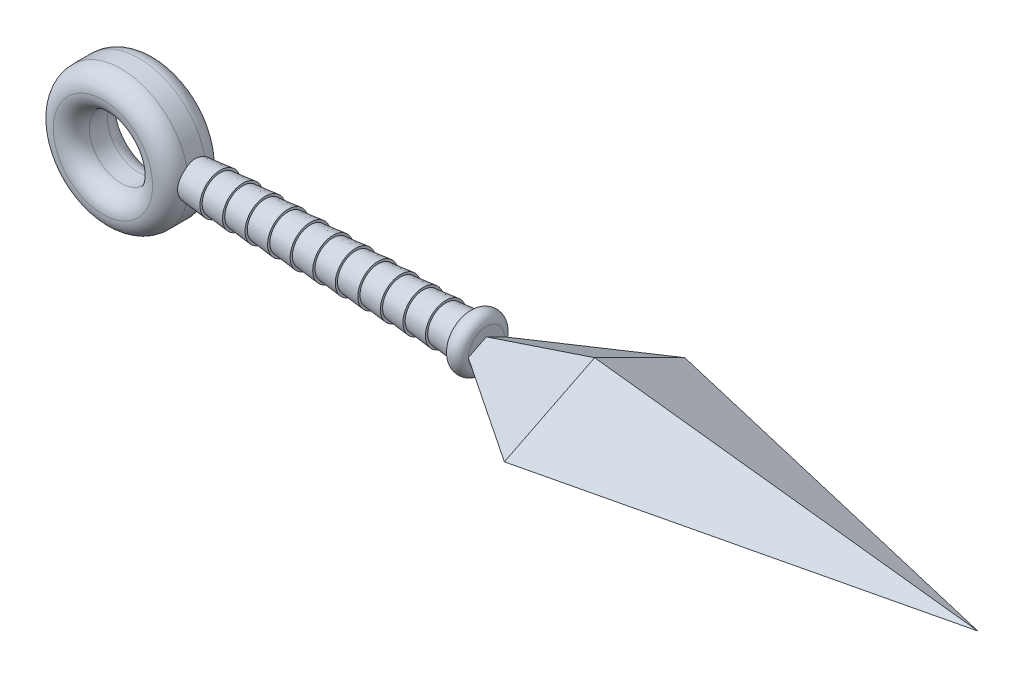
ISO-10303-21;
HEADER;
FILE_DESCRIPTION(('STEP AP214'),'2;1');
FILE_NAME('part.step','',(''),(''),'','','');
FILE_SCHEMA(('AUTOMOTIVE_DESIGN { 1 0 10303 214 1 1 1 1 }'));
ENDSEC;
DATA;
#1=APPLICATION_CONTEXT('core data for automotive mechanical design processes');
#2=APPLICATION_PROTOCOL_DEFINITION('international standard','automotive_design',2000,#1);
#3=PRODUCT_CONTEXT('',#1,'mechanical');
#4=PRODUCT('Part','Part','',(#3));
#5=PRODUCT_RELATED_PRODUCT_CATEGORY('part','',(#4));
#6=PRODUCT_DEFINITION_FORMATION('','',#4);
#7=PRODUCT_DEFINITION_CONTEXT('part definition',#1,'design');
#8=PRODUCT_DEFINITION('design','',#6,#7);
#9=PRODUCT_DEFINITION_SHAPE('','',#8);
#10=(LENGTH_UNIT() NAMED_UNIT(*) SI_UNIT(.MILLI.,.METRE.));
#11=(NAMED_UNIT(*) PLANE_ANGLE_UNIT() SI_UNIT($,.RADIAN.));
#12=(NAMED_UNIT(*) SI_UNIT($,.STERADIAN.) SOLID_ANGLE_UNIT());
#13=UNCERTAINTY_MEASURE_WITH_UNIT(LENGTH_MEASURE(1.E-05),#10,'distance_accuracy_value','');
#14=(GEOMETRIC_REPRESENTATION_CONTEXT(3) GLOBAL_UNCERTAINTY_ASSIGNED_CONTEXT((#13)) GLOBAL_UNIT_ASSIGNED_CONTEXT((#10,
#11,#12)) REPRESENTATION_CONTEXT('',''));
#15=CARTESIAN_POINT('',(0.,0.,0.));
#16=DIRECTION('',(0.,0.,1.));
#17=DIRECTION('',(1.,0.,0.));
#18=AXIS2_PLACEMENT_3D('',#15,#16,#17);
#19=CARTESIAN_POINT('',(79.,0.,0.));
#20=DIRECTION('',(-1.,0.,0.));
#21=DIRECTION('',(0.,0.,1.));
#22=AXIS2_PLACEMENT_3D('',#19,#20,#21);
#23=PLANE('',#22);
#24=DIRECTION('',(0.,-0.447213595499958,0.894427190999916));
#25=VECTOR('',#24,1.);
#26=CARTESIAN_POINT('',(79.,2.,0.));
#27=LINE('',#26,#25);
#28=CARTESIAN_POINT('',(79.,2.,0.));
#29=VERTEX_POINT('',#28);
#30=CARTESIAN_POINT('',(79.,0.,4.));
#31=VERTEX_POINT('',#30);
#32=EDGE_CURVE('E376',#29,#31,#27,.T.);
#33=ORIENTED_EDGE('',*,*,#32,.F.);
#34=DIRECTION('',(0.,0.447213595499958,0.894427190999916));
#35=VECTOR('',#34,1.);
#36=CARTESIAN_POINT('',(79.,0.,-4.));
#37=LINE('',#36,#35);
#38=CARTESIAN_POINT('',(79.,0.,-4.));
#39=VERTEX_POINT('',#38);
#40=EDGE_CURVE('E128',#39,#29,#37,.T.);
#41=ORIENTED_EDGE('',*,*,#40,.F.);
#42=CARTESIAN_POINT('',(79.,0.,0.));
#43=DIRECTION('',(1.,0.,0.));
#44=DIRECTION('',(0.,0.,-1.));
#45=AXIS2_PLACEMENT_3D('',#42,#43,#44);
#46=CIRCLE('',#45,4.);
#47=EDGE_CURVE('E75',#39,#31,#46,.T.);
#48=ORIENTED_EDGE('',*,*,#47,.T.);
#49=EDGE_LOOP('',(#33,#41,#48));
#50=FACE_BOUND('',#49,.T.);
#51=ADVANCED_FACE('F65',(#50),#23,.F.);
#52=CARTESIAN_POINT('',(77.,0.,0.));
#53=DIRECTION('',(1.,0.,0.));
#54=DIRECTION('',(0.,0.,-1.));
#55=AXIS2_PLACEMENT_3D('',#52,#53,#54);
#56=TOROIDAL_SURFACE('',#55,4.,2.);
#57=ORIENTED_EDGE('',*,*,#47,.F.);
#58=EDGE_CURVE('E387',#31,#39,#46,.T.);
#59=ORIENTED_EDGE('',*,*,#58,.F.);
#60=EDGE_LOOP('',(#57,#59));
#61=FACE_BOUND('',#60,.T.);
#62=CARTESIAN_POINT('',(75.0652035958993,0.,0.));
#63=DIRECTION('',(1.,0.,0.));
#64=DIRECTION('',(0.,0.,-1.));
#65=AXIS2_PLACEMENT_3D('',#62,#63,#64);
#66=CIRCLE('',#65,4.50652035958993);
#67=CARTESIAN_POINT('',(75.0652035958993,0.,-4.50652035958993));
#68=VERTEX_POINT('',#67);
#69=EDGE_CURVE('E13',#68,#68,#66,.F.);
#70=ORIENTED_EDGE('',*,*,#69,.F.);
#71=EDGE_LOOP('',(#70));
#72=FACE_BOUND('',#71,.T.);
#73=ADVANCED_FACE('F67',(#61,#72),#56,.T.);
#74=ORIENTED_EDGE('',*,*,#58,.T.);
#75=DIRECTION('',(0.,0.447213595499958,-0.894427190999916));
#76=VECTOR('',#75,1.);
#77=CARTESIAN_POINT('',(79.,-2.,0.));
#78=LINE('',#77,#76);
#79=CARTESIAN_POINT('',(79.,-2.,0.));
#80=VERTEX_POINT('',#79);
#81=EDGE_CURVE('E212',#80,#39,#78,.T.);
#82=ORIENTED_EDGE('',*,*,#81,.F.);
#83=DIRECTION('',(0.,-0.447213595499958,-0.894427190999916));
#84=VECTOR('',#83,1.);
#85=CARTESIAN_POINT('',(79.,0.,4.));
#86=LINE('',#85,#84);
#87=EDGE_CURVE('E379',#31,#80,#86,.T.);
#88=ORIENTED_EDGE('',*,*,#87,.F.);
#89=EDGE_LOOP('',(#74,#82,#88));
#90=FACE_BOUND('',#89,.T.);
#91=ADVANCED_FACE('F357',(#90),#23,.F.);
#92=CARTESIAN_POINT('',(75.,0.,0.));
#93=DIRECTION('',(1.,0.,0.));
#94=DIRECTION('',(0.,0.,-1.));
#95=AXIS2_PLACEMENT_3D('',#92,#93,#94);
#96=CONICAL_SURFACE('',#95,4.5,0.0996686524911618);
#97=CARTESIAN_POINT('',(70.,0.,0.));
#98=DIRECTION('',(-1.,0.,0.));
#99=DIRECTION('',(0.,0.,1.));
#100=AXIS2_PLACEMENT_3D('',#97,#98,#99);
#101=CIRCLE('',#100,4.);
#102=CARTESIAN_POINT('',(70.,0.,4.));
#103=VERTEX_POINT('',#102);
#104=EDGE_CURVE('E207',#103,#103,#101,.T.);
#105=ORIENTED_EDGE('',*,*,#104,.F.);
#106=EDGE_LOOP('',(#105));
#107=FACE_BOUND('',#106,.T.);
#108=ORIENTED_EDGE('',*,*,#69,.T.);
#109=EDGE_LOOP('',(#108));
#110=FACE_BOUND('',#109,.T.);
#111=ADVANCED_FACE('F359',(#107,#110),#96,.T.);
#112=CARTESIAN_POINT('',(0.,0.,6.));
#113=DIRECTION('',(0.,0.,-1.));
#114=DIRECTION('',(-1.,0.,0.));
#115=AXIS2_PLACEMENT_3D('',#112,#113,#114);
#116=CYLINDRICAL_SURFACE('',#115,15.);
#117=CARTESIAN_POINT('',(14.6053071349914,-3.41833343788607,2.00020000000001));
#118=CARTESIAN_POINT('',(14.5924589112699,-3.47320777410244,1.90389756692699));
#119=CARTESIAN_POINT('',(14.5802234231269,-3.52411177260544,1.80524747907719));
#120=CARTESIAN_POINT('',(14.5572953684385,-3.61766662668039,1.60392692198255));
#121=CARTESIAN_POINT('',(14.5466029263319,-3.66031681671976,1.50125612933652));
#122=CARTESIAN_POINT('',(14.5270869483398,-3.73701764129119,1.29265282019843));
#123=CARTESIAN_POINT('',(14.5182621992119,-3.77107386119855,1.1867224726432));
#124=CARTESIAN_POINT('',(14.5027318096196,-3.83036723531258,0.972274562545084));
#125=CARTESIAN_POINT('',(14.4960260572965,-3.85560485504713,0.863757136895433));
#126=CARTESIAN_POINT('',(14.4849300755814,-3.89708381566666,0.644796044806405));
#127=CARTESIAN_POINT('',(14.480541952856,-3.91331697239356,0.534350719817065));
#128=CARTESIAN_POINT('',(14.4742230743012,-3.93662457040182,0.312388307830953));
#129=CARTESIAN_POINT('',(14.4722931772722,-3.94369581091113,0.200870859980929));
#130=CARTESIAN_POINT('',(14.4709530171331,-3.94861055225303,-0.0223730528843796));
#131=CARTESIAN_POINT('',(14.4715425436065,-3.94645482370111,-0.13409949966554));
#132=CARTESIAN_POINT('',(14.4752226410761,-3.93293508592278,-0.356952415483685));
#133=CARTESIAN_POINT('',(14.4783132129355,-3.92157107351837,-0.468078884313589));
#134=CARTESIAN_POINT('',(14.4868465547033,-3.88992812377862,-0.687536449808845));
#135=CARTESIAN_POINT('',(14.4922593378006,-3.86976278270413,-0.795885125640328));
#136=CARTESIAN_POINT('',(14.5052686634585,-3.82070988278798,-1.01041620198221));
#137=CARTESIAN_POINT('',(14.5128644552535,-3.79182532242903,-1.11659933382904));
#138=CARTESIAN_POINT('',(14.5300059594372,-3.72559964127352,-1.32595579729252));
#139=CARTESIAN_POINT('',(14.539548780082,-3.68827105278459,-1.42913333609936));
#140=CARTESIAN_POINT('',(14.5603169880491,-3.60541198642497,-1.63192454881869));
#141=CARTESIAN_POINT('',(14.5715417132424,-3.55988473477098,-1.73153960617109));
#142=CARTESIAN_POINT('',(14.5905060465131,-3.48109636597889,-1.88686514125554));
#143=CARTESIAN_POINT('',(14.5978036226992,-3.45038934518262,-1.94393634445103));
#144=CARTESIAN_POINT('',(14.6053071349914,-3.41833343788607,-2.00020000000001));
#145=B_SPLINE_CURVE_WITH_KNOTS('',3,(#117,#118,#119,#120,#121,#122,#123,#124,#125,#126,#127,
#128,#129,#130,#131,#132,#133,#134,#135,#136,#137,#138,#139,#140,#141,#142,#143,#144),
.UNSPECIFIED.,.F.,.F.,(4,2,2,2,2,2,2,2,2,2,2,2,2,4),(0.,0.334653429279474,0.669333831568065,
1.00379615557934,1.33824082088474,1.67298896699972,2.0078540279433,2.34269112226372,
2.67752833214456,3.00816609769696,3.33869028836177,3.66872710911672,3.9986343413259,
4.19420455925245),.UNSPECIFIED.);
#146=CARTESIAN_POINT('',(14.6052804693855,-3.41844736840965,2.));
#147=VERTEX_POINT('',#146);
#148=CARTESIAN_POINT('',(14.6052804693855,-3.41844736840965,-2.));
#149=VERTEX_POINT('',#148);
#150=EDGE_CURVE('E304',#147,#149,#145,.T.);
#151=ORIENTED_EDGE('',*,*,#150,.F.);
#152=CARTESIAN_POINT('',(0.,0.,2.));
#153=DIRECTION('',(0.,0.,1.));
#154=DIRECTION('',(1.,0.,0.));
#155=AXIS2_PLACEMENT_3D('',#152,#153,#154);
#156=CIRCLE('',#155,15.);
#157=CARTESIAN_POINT('',(14.6052804693837,3.41844736841711,2.));
#158=VERTEX_POINT('',#157);
#159=EDGE_CURVE('E415',#147,#158,#156,.F.);
#160=ORIENTED_EDGE('',*,*,#159,.T.);
#161=CARTESIAN_POINT('',(14.6053071349914,3.41833343788607,-2.00020000000001));
#162=CARTESIAN_POINT('',(14.5924589112699,3.47320777410244,-1.90389756692699));
#163=CARTESIAN_POINT('',(14.5802234231269,3.52411177260544,-1.80524747907719));
#164=CARTESIAN_POINT('',(14.5572953684385,3.61766662668039,-1.60392692198255));
#165=CARTESIAN_POINT('',(14.5466029263319,3.66031681671976,-1.50125612933652));
#166=CARTESIAN_POINT('',(14.5270869483398,3.73701764129119,-1.29265282019843));
#167=CARTESIAN_POINT('',(14.5182621992119,3.77107386119855,-1.1867224726432));
#168=CARTESIAN_POINT('',(14.5027318096196,3.83036723531258,-0.972274562545084));
#169=CARTESIAN_POINT('',(14.4960260572965,3.85560485504713,-0.863757136895433));
#170=CARTESIAN_POINT('',(14.4849300755814,3.89708381566666,-0.644796044806405));
#171=CARTESIAN_POINT('',(14.480541952856,3.91331697239356,-0.534350719817065));
#172=CARTESIAN_POINT('',(14.4742230743012,3.93662457040182,-0.312388307830953));
#173=CARTESIAN_POINT('',(14.4722931772722,3.94369581091113,-0.200870859980929));
#174=CARTESIAN_POINT('',(14.4709530171331,3.94861055225303,0.0223730528843796));
#175=CARTESIAN_POINT('',(14.4715425436065,3.94645482370111,0.13409949966554));
#176=CARTESIAN_POINT('',(14.4752226410761,3.93293508592278,0.356952415483685));
#177=CARTESIAN_POINT('',(14.4783132129355,3.92157107351837,0.468078884313589));
#178=CARTESIAN_POINT('',(14.4868465547033,3.88992812377862,0.687536449808845));
#179=CARTESIAN_POINT('',(14.4922593378006,3.86976278270413,0.795885125640328));
#180=CARTESIAN_POINT('',(14.5052686634585,3.82070988278798,1.01041620198221));
#181=CARTESIAN_POINT('',(14.5128644552535,3.79182532242903,1.11659933382904));
#182=CARTESIAN_POINT('',(14.5300059594372,3.72559964127352,1.32595579729252));
#183=CARTESIAN_POINT('',(14.539548780082,3.68827105278459,1.42913333609936));
#184=CARTESIAN_POINT('',(14.5603169880491,3.60541198642497,1.63192454881869));
#185=CARTESIAN_POINT('',(14.5715417132424,3.55988473477098,1.73153960617109));
#186=CARTESIAN_POINT('',(14.5905060465131,3.48109636597889,1.88686514125554));
#187=CARTESIAN_POINT('',(14.5978036226992,3.45038934518262,1.94393634445103));
#188=CARTESIAN_POINT('',(14.6053071349914,3.41833343788607,2.00020000000001));
#189=B_SPLINE_CURVE_WITH_KNOTS('',3,(#161,#162,#163,#164,#165,#166,#167,#168,#169,#170,#171,
#172,#173,#174,#175,#176,#177,#178,#179,#180,#181,#182,#183,#184,#185,#186,#187,#188),
.UNSPECIFIED.,.F.,.F.,(4,2,2,2,2,2,2,2,2,2,2,2,2,4),(0.,0.334653429279474,0.669333831568065,
1.00379615557934,1.33824082088474,1.67298896699972,2.0078540279433,2.34269112226372,
2.67752833214456,3.00816609769696,3.33869028836177,3.66872710911672,3.9986343413259,
4.19420455925245),.UNSPECIFIED.);
#190=CARTESIAN_POINT('',(14.605280469386,3.41844736840723,-2.00000000000425));
#191=VERTEX_POINT('',#190);
#192=EDGE_CURVE('E91',#191,#158,#189,.T.);
#193=ORIENTED_EDGE('',*,*,#192,.F.);
#194=CARTESIAN_POINT('',(0.,0.,-2.));
#195=DIRECTION('',(0.,0.,1.));
#196=DIRECTION('',(1.,0.,0.));
#197=AXIS2_PLACEMENT_3D('',#194,#195,#196);
#198=CIRCLE('',#197,15.);
#199=EDGE_CURVE('E412',#191,#149,#198,.T.);
#200=ORIENTED_EDGE('',*,*,#199,.T.);
#201=EDGE_LOOP('',(#151,#160,#193,#200));
#202=FACE_BOUND('',#201,.T.);
#203=ADVANCED_FACE('F310',(#202),#116,.T.);
#204=CARTESIAN_POINT('',(0.,0.,-2.));
#205=DIRECTION('',(0.,0.,1.));
#206=DIRECTION('',(1.,0.,0.));
#207=AXIS2_PLACEMENT_3D('',#204,#205,#206);
#208=TOROIDAL_SURFACE('',#207,11.,4.);
#209=CARTESIAN_POINT('',(0.,0.,-6.));
#210=DIRECTION('',(0.,0.,1.));
#211=DIRECTION('',(1.,0.,0.));
#212=AXIS2_PLACEMENT_3D('',#209,#210,#211);
#213=CIRCLE('',#212,11.);
#214=CARTESIAN_POINT('',(11.,0.,-6.));
#215=VERTEX_POINT('',#214);
#216=EDGE_CURVE('E425',#215,#215,#213,.F.);
#217=ORIENTED_EDGE('',*,*,#216,.F.);
#218=EDGE_LOOP('',(#217));
#219=FACE_BOUND('',#218,.T.);
#220=ORIENTED_EDGE('',*,*,#199,.F.);
#221=CARTESIAN_POINT('',(14.6052538013986,3.41856128316167,-1.9998));
#222=CARTESIAN_POINT('',(14.6168886056429,3.3689337661361,-2.08697745222755));
#223=CARTESIAN_POINT('',(14.6261611809903,3.31563447820595,-2.17234340125315));
#224=CARTESIAN_POINT('',(14.6404992523372,3.20222208396472,-2.33870752524571));
#225=CARTESIAN_POINT('',(14.6455678494444,3.14211403747239,-2.41970887848465));
#226=CARTESIAN_POINT('',(14.6520143266715,3.01586522814035,-2.57632524295126));
#227=CARTESIAN_POINT('',(14.6534110895352,2.94975714625694,-2.65196585797092));
#228=CARTESIAN_POINT('',(14.6531506695125,2.81179614393784,-2.7977874455215));
#229=CARTESIAN_POINT('',(14.6514930032894,2.7399423160092,-2.86796755214308));
#230=CARTESIAN_POINT('',(14.6428556035745,2.5169316359814,-3.06929420260268));
#231=CARTESIAN_POINT('',(14.632224715029,2.35790585763973,-3.19174528537385));
#232=CARTESIAN_POINT('',(14.6062113350226,2.02320807816559,-3.41076473446287));
#233=CARTESIAN_POINT('',(14.5908221222477,1.84751277558099,-3.50729612555802));
#234=CARTESIAN_POINT('',(14.5590195970269,1.4685736667904,-3.67955249064502));
#235=CARTESIAN_POINT('',(14.5426249699373,1.26425161898159,-3.75294226802996));
#236=CARTESIAN_POINT('',(14.5222940796356,0.950889803598032,-3.83766742067875));
#237=CARTESIAN_POINT('',(14.516225806907,0.845248253732224,-3.8616868234502));
#238=CARTESIAN_POINT('',(14.5059953893666,0.632296465865986,-3.9011719311464));
#239=CARTESIAN_POINT('',(14.5018325639888,0.524986837832244,-3.91664069050307));
#240=CARTESIAN_POINT('',(14.495672654491,0.305916281577942,-3.93929152390673));
#241=CARTESIAN_POINT('',(14.4937501835138,0.194123855846594,-3.94618859183604));
#242=CARTESIAN_POINT('',(14.4924905527571,-0.0296658724465396,-3.95072319874244));
#243=CARTESIAN_POINT('',(14.4931534614518,-0.141663180356138,-3.94836049247291));
#244=CARTESIAN_POINT('',(14.4970073461422,-0.365032620311258,-3.9343874046993));
#245=CARTESIAN_POINT('',(14.500198132667,-0.476404798581812,-3.92277771627986));
#246=CARTESIAN_POINT('',(14.5088112540128,-0.697735230074261,-3.89039262923264));
#247=CARTESIAN_POINT('',(14.5142344177499,-0.807692942426564,-3.86961382576484));
#248=CARTESIAN_POINT('',(14.5329793672069,-1.13105275449472,-3.79443002910901));
#249=CARTESIAN_POINT('',(14.5488618812101,-1.3414088042905,-3.72695402724139));
#250=CARTESIAN_POINT('',(14.5821737720588,-1.74811448820437,-3.55810286274304));
#251=CARTESIAN_POINT('',(14.5996042126016,-1.94445432095886,-3.45670425483553));
#252=CARTESIAN_POINT('',(14.622102798513,-2.22584044681893,-3.27984081481089));
#253=CARTESIAN_POINT('',(14.6290407535839,-2.31823358732975,-3.21605567026576));
#254=CARTESIAN_POINT('',(14.6407212909767,-2.49720904050375,-3.08064696374382));
#255=CARTESIAN_POINT('',(14.6454649313819,-2.58379413650852,-3.00902720020886));
#256=CARTESIAN_POINT('',(14.651872068139,-2.75024745807054,-2.85856829165858));
#257=CARTESIAN_POINT('',(14.6535418874857,-2.83012914885058,-2.77974431765326));
#258=CARTESIAN_POINT('',(14.652974691533,-2.98258672274768,-2.6153988617008));
#259=CARTESIAN_POINT('',(14.6507401315321,-3.05516716695647,-2.52988162116602));
#260=CARTESIAN_POINT('',(14.6425254329121,-3.17813889499431,-2.3712052309342));
#261=CARTESIAN_POINT('',(14.6374153929533,-3.23001498954274,-2.29914742891945));
#262=CARTESIAN_POINT('',(14.6238954957585,-3.32839111666885,-2.15179217609127));
#263=CARTESIAN_POINT('',(14.6154869850586,-3.37489333301096,-2.07649605841057));
#264=CARTESIAN_POINT('',(14.6052538013986,-3.41856128316167,-1.9998));
#265=B_SPLINE_CURVE_WITH_KNOTS('',3,(#221,#222,#223,#224,#225,#226,#227,#228,#229,#230,#231,
#232,#233,#234,#235,#236,#237,#238,#239,#240,#241,#242,#243,#244,#245,#246,#247,#248,#249,#250,
#251,#252,#253,#254,#255,#256,#257,#258,#259,#260,#261,#262,#263,#264),.UNSPECIFIED.,.F.,.F.,(4,
2,2,2,2,2,2,2,2,2,2,2,2,2,2,2,2,2,2,2,2,4),(0.,0.30280198156603,0.605380398985578,
0.906399707354234,1.20746665349034,1.80762399174257,2.40863297809067,3.0585960348837,
3.38382304808324,3.70893380958784,4.04458792509431,4.38025093051438,4.71588877951193,
5.05165136858701,5.71288317581384,6.37457293431131,6.71166168628763,7.048587726553,
7.38481991625431,7.72084073988749,7.98737610735538,8.25380278003107),.UNSPECIFIED.);
#266=EDGE_CURVE('E333',#191,#149,#265,.T.);
#267=ORIENTED_EDGE('',*,*,#266,.T.);
#268=EDGE_LOOP('',(#220,#267));
#269=FACE_BOUND('',#268,.T.);
#270=ADVANCED_FACE('F345',(#219,#269),#208,.T.);
#271=CARTESIAN_POINT('',(0.,0.,2.));
#272=DIRECTION('',(0.,0.,1.));
#273=DIRECTION('',(1.,0.,0.));
#274=AXIS2_PLACEMENT_3D('',#271,#272,#273);
#275=TOROIDAL_SURFACE('',#274,11.,4.);
#276=CARTESIAN_POINT('',(0.,0.,6.));
#277=DIRECTION('',(0.,0.,1.));
#278=DIRECTION('',(1.,0.,0.));
#279=AXIS2_PLACEMENT_3D('',#276,#277,#278);
#280=CIRCLE('',#279,11.);
#281=CARTESIAN_POINT('',(11.,0.,6.));
#282=VERTEX_POINT('',#281);
#283=EDGE_CURVE('E342',#282,#282,#280,.T.);
#284=ORIENTED_EDGE('',*,*,#283,.F.);
#285=EDGE_LOOP('',(#284));
#286=FACE_BOUND('',#285,.T.);
#287=ORIENTED_EDGE('',*,*,#159,.F.);
#288=CARTESIAN_POINT('',(14.6052538013986,-3.41856128316167,1.9998));
#289=CARTESIAN_POINT('',(14.6168886056429,-3.3689337661361,2.08697745222755));
#290=CARTESIAN_POINT('',(14.6261611809903,-3.31563447820595,2.17234340125315));
#291=CARTESIAN_POINT('',(14.6404992523372,-3.20222208396472,2.33870752524571));
#292=CARTESIAN_POINT('',(14.6455678494444,-3.14211403747239,2.41970887848465));
#293=CARTESIAN_POINT('',(14.6520143266715,-3.01586522814035,2.57632524295126));
#294=CARTESIAN_POINT('',(14.6534110895352,-2.94975714625694,2.65196585797092));
#295=CARTESIAN_POINT('',(14.6531506695125,-2.81179614393784,2.7977874455215));
#296=CARTESIAN_POINT('',(14.6514930032894,-2.7399423160092,2.86796755214308));
#297=CARTESIAN_POINT('',(14.6428556035745,-2.5169316359814,3.06929420260268));
#298=CARTESIAN_POINT('',(14.632224715029,-2.35790585763973,3.19174528537385));
#299=CARTESIAN_POINT('',(14.6062113350226,-2.02320807816559,3.41076473446287));
#300=CARTESIAN_POINT('',(14.5908221222477,-1.84751277558099,3.50729612555802));
#301=CARTESIAN_POINT('',(14.5590195970269,-1.4685736667904,3.67955249064502));
#302=CARTESIAN_POINT('',(14.5426249699373,-1.26425161898159,3.75294226802996));
#303=CARTESIAN_POINT('',(14.5222940796356,-0.950889803598032,3.83766742067875));
#304=CARTESIAN_POINT('',(14.516225806907,-0.845248253732224,3.8616868234502));
#305=CARTESIAN_POINT('',(14.5059953893666,-0.632296465865986,3.9011719311464));
#306=CARTESIAN_POINT('',(14.5018325639888,-0.524986837832244,3.91664069050307));
#307=CARTESIAN_POINT('',(14.495672654491,-0.305916281577942,3.93929152390673));
#308=CARTESIAN_POINT('',(14.4937501835138,-0.194123855846594,3.94618859183604));
#309=CARTESIAN_POINT('',(14.4924905527571,0.0296658724465396,3.95072319874244));
#310=CARTESIAN_POINT('',(14.4931534614518,0.141663180356138,3.94836049247291));
#311=CARTESIAN_POINT('',(14.4970073461422,0.365032620311258,3.9343874046993));
#312=CARTESIAN_POINT('',(14.500198132667,0.476404798581812,3.92277771627986));
#313=CARTESIAN_POINT('',(14.5088112540128,0.697735230074261,3.89039262923264));
#314=CARTESIAN_POINT('',(14.5142344177499,0.807692942426564,3.86961382576484));
#315=CARTESIAN_POINT('',(14.5329793672069,1.13105275449472,3.79443002910901));
#316=CARTESIAN_POINT('',(14.5488618812101,1.3414088042905,3.72695402724139));
#317=CARTESIAN_POINT('',(14.5821737720588,1.74811448820437,3.55810286274304));
#318=CARTESIAN_POINT('',(14.5996042126016,1.94445432095886,3.45670425483553));
#319=CARTESIAN_POINT('',(14.622102798513,2.22584044681893,3.27984081481089));
#320=CARTESIAN_POINT('',(14.6290407535839,2.31823358732975,3.21605567026576));
#321=CARTESIAN_POINT('',(14.6407212909767,2.49720904050375,3.08064696374382));
#322=CARTESIAN_POINT('',(14.6454649313819,2.58379413650852,3.00902720020886));
#323=CARTESIAN_POINT('',(14.651872068139,2.75024745807054,2.85856829165858));
#324=CARTESIAN_POINT('',(14.6535418874857,2.83012914885058,2.77974431765326));
#325=CARTESIAN_POINT('',(14.652974691533,2.98258672274768,2.6153988617008));
#326=CARTESIAN_POINT('',(14.6507401315321,3.05516716695647,2.52988162116602));
#327=CARTESIAN_POINT('',(14.6425254329121,3.17813889499431,2.3712052309342));
#328=CARTESIAN_POINT('',(14.6374153929533,3.23001498954274,2.29914742891945));
#329=CARTESIAN_POINT('',(14.6238954957585,3.32839111666885,2.15179217609127));
#330=CARTESIAN_POINT('',(14.6154869850586,3.37489333301096,2.07649605841057));
#331=CARTESIAN_POINT('',(14.6052538013986,3.41856128316167,1.9998));
#332=B_SPLINE_CURVE_WITH_KNOTS('',3,(#288,#289,#290,#291,#292,#293,#294,#295,#296,#297,#298,
#299,#300,#301,#302,#303,#304,#305,#306,#307,#308,#309,#310,#311,#312,#313,#314,#315,#316,#317,
#318,#319,#320,#321,#322,#323,#324,#325,#326,#327,#328,#329,#330,#331),.UNSPECIFIED.,.F.,.F.,(4,
2,2,2,2,2,2,2,2,2,2,2,2,2,2,2,2,2,2,2,2,4),(0.,0.30280198156603,0.605380398985578,
0.906399707354234,1.20746665349034,1.80762399174257,2.40863297809067,3.0585960348837,
3.38382304808324,3.70893380958784,4.04458792509431,4.38025093051438,4.71588877951193,
5.05165136858701,5.71288317581384,6.37457293431131,6.71166168628763,7.048587726553,
7.38481991625431,7.72084073988749,7.98737610735538,8.25380278003107),.UNSPECIFIED.);
#333=EDGE_CURVE('E325',#147,#158,#332,.T.);
#334=ORIENTED_EDGE('',*,*,#333,.T.);
#335=EDGE_LOOP('',(#287,#334));
#336=FACE_BOUND('',#335,.T.);
#337=ADVANCED_FACE('F349',(#286,#336),#275,.T.);
#338=CARTESIAN_POINT('',(0.,0.,6.));
#339=DIRECTION('',(0.,0.,-1.));
#340=DIRECTION('',(-1.,0.,0.));
#341=AXIS2_PLACEMENT_3D('',#338,#339,#340);
#342=CYLINDRICAL_SURFACE('',#341,7.);
#343=CARTESIAN_POINT('',(0.,0.,-2.));
#344=DIRECTION('',(0.,0.,1.));
#345=DIRECTION('',(1.,0.,0.));
#346=AXIS2_PLACEMENT_3D('',#343,#344,#345);
#347=CIRCLE('',#346,7.);
#348=CARTESIAN_POINT('',(7.,0.,-2.));
#349=VERTEX_POINT('',#348);
#350=EDGE_CURVE('E419',#349,#349,#347,.F.);
#351=ORIENTED_EDGE('',*,*,#350,.T.);
#352=EDGE_LOOP('',(#351));
#353=FACE_BOUND('',#352,.T.);
#354=CARTESIAN_POINT('',(0.,0.,2.));
#355=DIRECTION('',(0.,0.,1.));
#356=DIRECTION('',(1.,0.,0.));
#357=AXIS2_PLACEMENT_3D('',#354,#355,#356);
#358=CIRCLE('',#357,7.);
#359=CARTESIAN_POINT('',(7.,0.,2.));
#360=VERTEX_POINT('',#359);
#361=EDGE_CURVE('E343',#360,#360,#358,.T.);
#362=ORIENTED_EDGE('',*,*,#361,.T.);
#363=EDGE_LOOP('',(#362));
#364=FACE_BOUND('',#363,.T.);
#365=ADVANCED_FACE('F321',(#353,#364),#342,.F.);
#366=CARTESIAN_POINT('',(0.,0.,-2.));
#367=DIRECTION('',(0.,0.,1.));
#368=DIRECTION('',(1.,0.,0.));
#369=AXIS2_PLACEMENT_3D('',#366,#367,#368);
#370=TOROIDAL_SURFACE('',#369,11.,4.);
#371=ORIENTED_EDGE('',*,*,#350,.F.);
#372=EDGE_LOOP('',(#371));
#373=FACE_BOUND('',#372,.T.);
#374=ORIENTED_EDGE('',*,*,#216,.T.);
#375=EDGE_LOOP('',(#374));
#376=FACE_BOUND('',#375,.T.);
#377=ADVANCED_FACE('F351',(#373,#376),#370,.T.);
#378=CARTESIAN_POINT('',(0.,0.,2.));
#379=DIRECTION('',(0.,0.,1.));
#380=DIRECTION('',(1.,0.,0.));
#381=AXIS2_PLACEMENT_3D('',#378,#379,#380);
#382=TOROIDAL_SURFACE('',#381,11.,4.);
#383=ORIENTED_EDGE('',*,*,#283,.T.);
#384=EDGE_LOOP('',(#383));
#385=FACE_BOUND('',#384,.T.);
#386=ORIENTED_EDGE('',*,*,#361,.F.);
#387=EDGE_LOOP('',(#386));
#388=FACE_BOUND('',#387,.T.);
#389=ADVANCED_FACE('F319',(#385,#388),#382,.T.);
#390=CARTESIAN_POINT('',(20.,0.,0.));
#391=DIRECTION('',(1.,0.,0.));
#392=DIRECTION('',(0.,0.,-1.));
#393=AXIS2_PLACEMENT_3D('',#390,#391,#392);
#394=CONICAL_SURFACE('',#393,4.5,0.0996686524911618);
#395=ORIENTED_EDGE('',*,*,#266,.F.);
#396=ORIENTED_EDGE('',*,*,#192,.T.);
#397=ORIENTED_EDGE('',*,*,#333,.F.);
#398=ORIENTED_EDGE('',*,*,#150,.T.);
#399=EDGE_LOOP('',(#395,#396,#397,#398));
#400=FACE_BOUND('',#399,.T.);
#401=CARTESIAN_POINT('',(20.,0.,0.));
#402=DIRECTION('',(-1.,0.,0.));
#403=DIRECTION('',(0.,0.,1.));
#404=AXIS2_PLACEMENT_3D('',#401,#402,#403);
#405=CIRCLE('',#404,4.5);
#406=CARTESIAN_POINT('',(20.,0.,4.5));
#407=VERTEX_POINT('',#406);
#408=EDGE_CURVE('E292',#407,#407,#405,.T.);
#409=ORIENTED_EDGE('',*,*,#408,.T.);
#410=EDGE_LOOP('',(#409));
#411=FACE_BOUND('',#410,.T.);
#412=ADVANCED_FACE('F314',(#400,#411),#394,.T.);
#413=CARTESIAN_POINT('',(20.,0.,0.));
#414=DIRECTION('',(-1.,0.,0.));
#415=DIRECTION('',(0.,0.,1.));
#416=AXIS2_PLACEMENT_3D('',#413,#414,#415);
#417=PLANE('',#416);
#418=CARTESIAN_POINT('',(20.,0.,0.));
#419=DIRECTION('',(-1.,0.,0.));
#420=DIRECTION('',(0.,0.,1.));
#421=AXIS2_PLACEMENT_3D('',#418,#419,#420);
#422=CIRCLE('',#421,4.);
#423=CARTESIAN_POINT('',(20.,0.,4.));
#424=VERTEX_POINT('',#423);
#425=EDGE_CURVE('E288',#424,#424,#422,.T.);
#426=ORIENTED_EDGE('',*,*,#425,.T.);
#427=EDGE_LOOP('',(#426));
#428=FACE_BOUND('',#427,.T.);
#429=ORIENTED_EDGE('',*,*,#408,.F.);
#430=EDGE_LOOP('',(#429));
#431=FACE_BOUND('',#430,.T.);
#432=ADVANCED_FACE('F318',(#428,#431),#417,.F.);
#433=CARTESIAN_POINT('',(25.,0.,0.));
#434=DIRECTION('',(1.,0.,0.));
#435=DIRECTION('',(0.,0.,-1.));
#436=AXIS2_PLACEMENT_3D('',#433,#434,#435);
#437=CONICAL_SURFACE('',#436,4.5,0.0996686524911618);
#438=ORIENTED_EDGE('',*,*,#425,.F.);
#439=EDGE_LOOP('',(#438));
#440=FACE_BOUND('',#439,.T.);
#441=CARTESIAN_POINT('',(25.,0.,0.));
#442=DIRECTION('',(-1.,0.,0.));
#443=DIRECTION('',(0.,0.,1.));
#444=AXIS2_PLACEMENT_3D('',#441,#442,#443);
#445=CIRCLE('',#444,4.5);
#446=CARTESIAN_POINT('',(25.,0.,4.5));
#447=VERTEX_POINT('',#446);
#448=EDGE_CURVE('E284',#447,#447,#445,.T.);
#449=ORIENTED_EDGE('',*,*,#448,.T.);
#450=EDGE_LOOP('',(#449));
#451=FACE_BOUND('',#450,.T.);
#452=ADVANCED_FACE('F469',(#440,#451),#437,.T.);
#453=CARTESIAN_POINT('',(25.,0.,0.));
#454=DIRECTION('',(-1.,0.,0.));
#455=DIRECTION('',(0.,0.,1.));
#456=AXIS2_PLACEMENT_3D('',#453,#454,#455);
#457=PLANE('',#456);
#458=CARTESIAN_POINT('',(25.,0.,0.));
#459=DIRECTION('',(-1.,0.,0.));
#460=DIRECTION('',(0.,0.,1.));
#461=AXIS2_PLACEMENT_3D('',#458,#459,#460);
#462=CIRCLE('',#461,4.);
#463=CARTESIAN_POINT('',(25.,0.,4.));
#464=VERTEX_POINT('',#463);
#465=EDGE_CURVE('E280',#464,#464,#462,.T.);
#466=ORIENTED_EDGE('',*,*,#465,.T.);
#467=EDGE_LOOP('',(#466));
#468=FACE_BOUND('',#467,.T.);
#469=ORIENTED_EDGE('',*,*,#448,.F.);
#470=EDGE_LOOP('',(#469));
#471=FACE_BOUND('',#470,.T.);
#472=ADVANCED_FACE('F475',(#468,#471),#457,.F.);
#473=CARTESIAN_POINT('',(30.,0.,0.));
#474=DIRECTION('',(1.,0.,0.));
#475=DIRECTION('',(0.,0.,-1.));
#476=AXIS2_PLACEMENT_3D('',#473,#474,#475);
#477=CONICAL_SURFACE('',#476,4.5,0.0996686524911618);
#478=ORIENTED_EDGE('',*,*,#465,.F.);
#479=EDGE_LOOP('',(#478));
#480=FACE_BOUND('',#479,.T.);
#481=CARTESIAN_POINT('',(30.,0.,0.));
#482=DIRECTION('',(-1.,0.,0.));
#483=DIRECTION('',(0.,0.,1.));
#484=AXIS2_PLACEMENT_3D('',#481,#482,#483);
#485=CIRCLE('',#484,4.5);
#486=CARTESIAN_POINT('',(30.,0.,4.5));
#487=VERTEX_POINT('',#486);
#488=EDGE_CURVE('E276',#487,#487,#485,.T.);
#489=ORIENTED_EDGE('',*,*,#488,.T.);
#490=EDGE_LOOP('',(#489));
#491=FACE_BOUND('',#490,.T.);
#492=ADVANCED_FACE('F481',(#480,#491),#477,.T.);
#493=CARTESIAN_POINT('',(30.,0.,0.));
#494=DIRECTION('',(-1.,0.,0.));
#495=DIRECTION('',(0.,0.,1.));
#496=AXIS2_PLACEMENT_3D('',#493,#494,#495);
#497=PLANE('',#496);
#498=CARTESIAN_POINT('',(30.,0.,0.));
#499=DIRECTION('',(-1.,0.,0.));
#500=DIRECTION('',(0.,0.,1.));
#501=AXIS2_PLACEMENT_3D('',#498,#499,#500);
#502=CIRCLE('',#501,4.);
#503=CARTESIAN_POINT('',(30.,0.,4.));
#504=VERTEX_POINT('',#503);
#505=EDGE_CURVE('E272',#504,#504,#502,.T.);
#506=ORIENTED_EDGE('',*,*,#505,.T.);
#507=EDGE_LOOP('',(#506));
#508=FACE_BOUND('',#507,.T.);
#509=ORIENTED_EDGE('',*,*,#488,.F.);
#510=EDGE_LOOP('',(#509));
#511=FACE_BOUND('',#510,.T.);
#512=ADVANCED_FACE('F488',(#508,#511),#497,.F.);
#513=CARTESIAN_POINT('',(35.,0.,0.));
#514=DIRECTION('',(1.,0.,0.));
#515=DIRECTION('',(0.,0.,-1.));
#516=AXIS2_PLACEMENT_3D('',#513,#514,#515);
#517=CONICAL_SURFACE('',#516,4.5,0.0996686524911618);
#518=ORIENTED_EDGE('',*,*,#505,.F.);
#519=EDGE_LOOP('',(#518));
#520=FACE_BOUND('',#519,.T.);
#521=CARTESIAN_POINT('',(35.,0.,0.));
#522=DIRECTION('',(-1.,0.,0.));
#523=DIRECTION('',(0.,0.,1.));
#524=AXIS2_PLACEMENT_3D('',#521,#522,#523);
#525=CIRCLE('',#524,4.5);
#526=CARTESIAN_POINT('',(35.,0.,4.5));
#527=VERTEX_POINT('',#526);
#528=EDGE_CURVE('E268',#527,#527,#525,.T.);
#529=ORIENTED_EDGE('',*,*,#528,.T.);
#530=EDGE_LOOP('',(#529));
#531=FACE_BOUND('',#530,.T.);
#532=ADVANCED_FACE('F495',(#520,#531),#517,.T.);
#533=CARTESIAN_POINT('',(35.,0.,0.));
#534=DIRECTION('',(-1.,0.,0.));
#535=DIRECTION('',(0.,0.,1.));
#536=AXIS2_PLACEMENT_3D('',#533,#534,#535);
#537=PLANE('',#536);
#538=CARTESIAN_POINT('',(35.,0.,0.));
#539=DIRECTION('',(-1.,0.,0.));
#540=DIRECTION('',(0.,0.,1.));
#541=AXIS2_PLACEMENT_3D('',#538,#539,#540);
#542=CIRCLE('',#541,4.);
#543=CARTESIAN_POINT('',(35.,0.,4.));
#544=VERTEX_POINT('',#543);
#545=EDGE_CURVE('E256',#544,#544,#542,.T.);
#546=ORIENTED_EDGE('',*,*,#545,.T.);
#547=EDGE_LOOP('',(#546));
#548=FACE_BOUND('',#547,.T.);
#549=ORIENTED_EDGE('',*,*,#528,.F.);
#550=EDGE_LOOP('',(#549));
#551=FACE_BOUND('',#550,.T.);
#552=ADVANCED_FACE('F502',(#548,#551),#537,.F.);
#553=CARTESIAN_POINT('',(45.,0.,0.));
#554=DIRECTION('',(1.,0.,0.));
#555=DIRECTION('',(0.,0.,-1.));
#556=AXIS2_PLACEMENT_3D('',#553,#554,#555);
#557=CONICAL_SURFACE('',#556,4.5,0.0996686524911618);
#558=CARTESIAN_POINT('',(40.,0.,0.));
#559=DIRECTION('',(-1.,0.,0.));
#560=DIRECTION('',(0.,0.,1.));
#561=AXIS2_PLACEMENT_3D('',#558,#559,#560);
#562=CIRCLE('',#561,4.);
#563=CARTESIAN_POINT('',(40.,0.,4.));
#564=VERTEX_POINT('',#563);
#565=EDGE_CURVE('E264',#564,#564,#562,.T.);
#566=ORIENTED_EDGE('',*,*,#565,.F.);
#567=EDGE_LOOP('',(#566));
#568=FACE_BOUND('',#567,.T.);
#569=CARTESIAN_POINT('',(45.,0.,0.));
#570=DIRECTION('',(-1.,0.,0.));
#571=DIRECTION('',(0.,0.,1.));
#572=AXIS2_PLACEMENT_3D('',#569,#570,#571);
#573=CIRCLE('',#572,4.5);
#574=CARTESIAN_POINT('',(45.,0.,4.5));
#575=VERTEX_POINT('',#574);
#576=EDGE_CURVE('E260',#575,#575,#573,.T.);
#577=ORIENTED_EDGE('',*,*,#576,.T.);
#578=EDGE_LOOP('',(#577));
#579=FACE_BOUND('',#578,.T.);
#580=ADVANCED_FACE('F509',(#568,#579),#557,.T.);
#581=CARTESIAN_POINT('',(45.,0.,0.));
#582=DIRECTION('',(-1.,0.,0.));
#583=DIRECTION('',(0.,0.,1.));
#584=AXIS2_PLACEMENT_3D('',#581,#582,#583);
#585=PLANE('',#584);
#586=CARTESIAN_POINT('',(45.,0.,0.));
#587=DIRECTION('',(-1.,0.,0.));
#588=DIRECTION('',(0.,0.,1.));
#589=AXIS2_PLACEMENT_3D('',#586,#587,#588);
#590=CIRCLE('',#589,4.);
#591=CARTESIAN_POINT('',(45.,0.,4.));
#592=VERTEX_POINT('',#591);
#593=EDGE_CURVE('E248',#592,#592,#590,.T.);
#594=ORIENTED_EDGE('',*,*,#593,.T.);
#595=EDGE_LOOP('',(#594));
#596=FACE_BOUND('',#595,.T.);
#597=ORIENTED_EDGE('',*,*,#576,.F.);
#598=EDGE_LOOP('',(#597));
#599=FACE_BOUND('',#598,.T.);
#600=ADVANCED_FACE('F516',(#596,#599),#585,.F.);
#601=CARTESIAN_POINT('',(40.,0.,0.));
#602=DIRECTION('',(1.,0.,0.));
#603=DIRECTION('',(0.,0.,-1.));
#604=AXIS2_PLACEMENT_3D('',#601,#602,#603);
#605=CONICAL_SURFACE('',#604,4.5,0.0996686524911618);
#606=ORIENTED_EDGE('',*,*,#545,.F.);
#607=EDGE_LOOP('',(#606));
#608=FACE_BOUND('',#607,.T.);
#609=CARTESIAN_POINT('',(40.,0.,0.));
#610=DIRECTION('',(-1.,0.,0.));
#611=DIRECTION('',(0.,0.,1.));
#612=AXIS2_PLACEMENT_3D('',#609,#610,#611);
#613=CIRCLE('',#612,4.5);
#614=CARTESIAN_POINT('',(40.,0.,4.5));
#615=VERTEX_POINT('',#614);
#616=EDGE_CURVE('E252',#615,#615,#613,.T.);
#617=ORIENTED_EDGE('',*,*,#616,.T.);
#618=EDGE_LOOP('',(#617));
#619=FACE_BOUND('',#618,.T.);
#620=ADVANCED_FACE('F523',(#608,#619),#605,.T.);
#621=CARTESIAN_POINT('',(40.,0.,0.));
#622=DIRECTION('',(-1.,0.,0.));
#623=DIRECTION('',(0.,0.,1.));
#624=AXIS2_PLACEMENT_3D('',#621,#622,#623);
#625=PLANE('',#624);
#626=ORIENTED_EDGE('',*,*,#565,.T.);
#627=EDGE_LOOP('',(#626));
#628=FACE_BOUND('',#627,.T.);
#629=ORIENTED_EDGE('',*,*,#616,.F.);
#630=EDGE_LOOP('',(#629));
#631=FACE_BOUND('',#630,.T.);
#632=ADVANCED_FACE('F530',(#628,#631),#625,.F.);
#633=CARTESIAN_POINT('',(50.,0.,0.));
#634=DIRECTION('',(1.,0.,0.));
#635=DIRECTION('',(0.,0.,-1.));
#636=AXIS2_PLACEMENT_3D('',#633,#634,#635);
#637=CONICAL_SURFACE('',#636,4.5,0.0996686524911618);
#638=ORIENTED_EDGE('',*,*,#593,.F.);
#639=EDGE_LOOP('',(#638));
#640=FACE_BOUND('',#639,.T.);
#641=CARTESIAN_POINT('',(50.,0.,0.));
#642=DIRECTION('',(-1.,0.,0.));
#643=DIRECTION('',(0.,0.,1.));
#644=AXIS2_PLACEMENT_3D('',#641,#642,#643);
#645=CIRCLE('',#644,4.5);
#646=CARTESIAN_POINT('',(50.,0.,4.5));
#647=VERTEX_POINT('',#646);
#648=EDGE_CURVE('E244',#647,#647,#645,.T.);
#649=ORIENTED_EDGE('',*,*,#648,.T.);
#650=EDGE_LOOP('',(#649));
#651=FACE_BOUND('',#650,.T.);
#652=ADVANCED_FACE('F537',(#640,#651),#637,.T.);
#653=CARTESIAN_POINT('',(50.,0.,0.));
#654=DIRECTION('',(-1.,0.,0.));
#655=DIRECTION('',(0.,0.,1.));
#656=AXIS2_PLACEMENT_3D('',#653,#654,#655);
#657=PLANE('',#656);
#658=CARTESIAN_POINT('',(50.,0.,0.));
#659=DIRECTION('',(-1.,0.,0.));
#660=DIRECTION('',(0.,0.,1.));
#661=AXIS2_PLACEMENT_3D('',#658,#659,#660);
#662=CIRCLE('',#661,4.);
#663=CARTESIAN_POINT('',(50.,0.,4.));
#664=VERTEX_POINT('',#663);
#665=EDGE_CURVE('E240',#664,#664,#662,.T.);
#666=ORIENTED_EDGE('',*,*,#665,.T.);
#667=EDGE_LOOP('',(#666));
#668=FACE_BOUND('',#667,.T.);
#669=ORIENTED_EDGE('',*,*,#648,.F.);
#670=EDGE_LOOP('',(#669));
#671=FACE_BOUND('',#670,.T.);
#672=ADVANCED_FACE('F544',(#668,#671),#657,.F.);
#673=CARTESIAN_POINT('',(55.,0.,0.));
#674=DIRECTION('',(1.,0.,0.));
#675=DIRECTION('',(0.,0.,-1.));
#676=AXIS2_PLACEMENT_3D('',#673,#674,#675);
#677=CONICAL_SURFACE('',#676,4.5,0.0996686524911618);
#678=ORIENTED_EDGE('',*,*,#665,.F.);
#679=EDGE_LOOP('',(#678));
#680=FACE_BOUND('',#679,.T.);
#681=CARTESIAN_POINT('',(55.,0.,0.));
#682=DIRECTION('',(-1.,0.,0.));
#683=DIRECTION('',(0.,0.,1.));
#684=AXIS2_PLACEMENT_3D('',#681,#682,#683);
#685=CIRCLE('',#684,4.5);
#686=CARTESIAN_POINT('',(55.,0.,4.5));
#687=VERTEX_POINT('',#686);
#688=EDGE_CURVE('E236',#687,#687,#685,.T.);
#689=ORIENTED_EDGE('',*,*,#688,.T.);
#690=EDGE_LOOP('',(#689));
#691=FACE_BOUND('',#690,.T.);
#692=ADVANCED_FACE('F551',(#680,#691),#677,.T.);
#693=CARTESIAN_POINT('',(55.,0.,0.));
#694=DIRECTION('',(-1.,0.,0.));
#695=DIRECTION('',(0.,0.,1.));
#696=AXIS2_PLACEMENT_3D('',#693,#694,#695);
#697=PLANE('',#696);
#698=CARTESIAN_POINT('',(55.,0.,0.));
#699=DIRECTION('',(-1.,0.,0.));
#700=DIRECTION('',(0.,0.,1.));
#701=AXIS2_PLACEMENT_3D('',#698,#699,#700);
#702=CIRCLE('',#701,4.);
#703=CARTESIAN_POINT('',(55.,0.,4.));
#704=VERTEX_POINT('',#703);
#705=EDGE_CURVE('E232',#704,#704,#702,.T.);
#706=ORIENTED_EDGE('',*,*,#705,.T.);
#707=EDGE_LOOP('',(#706));
#708=FACE_BOUND('',#707,.T.);
#709=ORIENTED_EDGE('',*,*,#688,.F.);
#710=EDGE_LOOP('',(#709));
#711=FACE_BOUND('',#710,.T.);
#712=ADVANCED_FACE('F558',(#708,#711),#697,.F.);
#713=CARTESIAN_POINT('',(60.,0.,0.));
#714=DIRECTION('',(1.,0.,0.));
#715=DIRECTION('',(0.,0.,-1.));
#716=AXIS2_PLACEMENT_3D('',#713,#714,#715);
#717=CONICAL_SURFACE('',#716,4.5,0.0996686524911618);
#718=ORIENTED_EDGE('',*,*,#705,.F.);
#719=EDGE_LOOP('',(#718));
#720=FACE_BOUND('',#719,.T.);
#721=CARTESIAN_POINT('',(60.,0.,0.));
#722=DIRECTION('',(-1.,0.,0.));
#723=DIRECTION('',(0.,0.,1.));
#724=AXIS2_PLACEMENT_3D('',#721,#722,#723);
#725=CIRCLE('',#724,4.5);
#726=CARTESIAN_POINT('',(60.,0.,4.5));
#727=VERTEX_POINT('',#726);
#728=EDGE_CURVE('E228',#727,#727,#725,.T.);
#729=ORIENTED_EDGE('',*,*,#728,.T.);
#730=EDGE_LOOP('',(#729));
#731=FACE_BOUND('',#730,.T.);
#732=ADVANCED_FACE('F565',(#720,#731),#717,.T.);
#733=CARTESIAN_POINT('',(60.,0.,0.));
#734=DIRECTION('',(-1.,0.,0.));
#735=DIRECTION('',(0.,0.,1.));
#736=AXIS2_PLACEMENT_3D('',#733,#734,#735);
#737=PLANE('',#736);
#738=CARTESIAN_POINT('',(60.,0.,0.));
#739=DIRECTION('',(-1.,0.,0.));
#740=DIRECTION('',(0.,0.,1.));
#741=AXIS2_PLACEMENT_3D('',#738,#739,#740);
#742=CIRCLE('',#741,4.);
#743=CARTESIAN_POINT('',(60.,0.,4.));
#744=VERTEX_POINT('',#743);
#745=EDGE_CURVE('E224',#744,#744,#742,.T.);
#746=ORIENTED_EDGE('',*,*,#745,.T.);
#747=EDGE_LOOP('',(#746));
#748=FACE_BOUND('',#747,.T.);
#749=ORIENTED_EDGE('',*,*,#728,.F.);
#750=EDGE_LOOP('',(#749));
#751=FACE_BOUND('',#750,.T.);
#752=ADVANCED_FACE('F572',(#748,#751),#737,.F.);
#753=CARTESIAN_POINT('',(65.,0.,0.));
#754=DIRECTION('',(1.,0.,0.));
#755=DIRECTION('',(0.,0.,-1.));
#756=AXIS2_PLACEMENT_3D('',#753,#754,#755);
#757=CONICAL_SURFACE('',#756,4.5,0.0996686524911618);
#758=ORIENTED_EDGE('',*,*,#745,.F.);
#759=EDGE_LOOP('',(#758));
#760=FACE_BOUND('',#759,.T.);
#761=CARTESIAN_POINT('',(65.,0.,0.));
#762=DIRECTION('',(-1.,0.,0.));
#763=DIRECTION('',(0.,0.,1.));
#764=AXIS2_PLACEMENT_3D('',#761,#762,#763);
#765=CIRCLE('',#764,4.5);
#766=CARTESIAN_POINT('',(65.,0.,4.5));
#767=VERTEX_POINT('',#766);
#768=EDGE_CURVE('E220',#767,#767,#765,.T.);
#769=ORIENTED_EDGE('',*,*,#768,.T.);
#770=EDGE_LOOP('',(#769));
#771=FACE_BOUND('',#770,.T.);
#772=ADVANCED_FACE('F579',(#760,#771),#757,.T.);
#773=CARTESIAN_POINT('',(65.,0.,0.));
#774=DIRECTION('',(-1.,0.,0.));
#775=DIRECTION('',(0.,0.,1.));
#776=AXIS2_PLACEMENT_3D('',#773,#774,#775);
#777=PLANE('',#776);
#778=CARTESIAN_POINT('',(65.,0.,0.));
#779=DIRECTION('',(-1.,0.,0.));
#780=DIRECTION('',(0.,0.,1.));
#781=AXIS2_PLACEMENT_3D('',#778,#779,#780);
#782=CIRCLE('',#781,4.);
#783=CARTESIAN_POINT('',(65.,0.,4.));
#784=VERTEX_POINT('',#783);
#785=EDGE_CURVE('E216',#784,#784,#782,.T.);
#786=ORIENTED_EDGE('',*,*,#785,.T.);
#787=EDGE_LOOP('',(#786));
#788=FACE_BOUND('',#787,.T.);
#789=ORIENTED_EDGE('',*,*,#768,.F.);
#790=EDGE_LOOP('',(#789));
#791=FACE_BOUND('',#790,.T.);
#792=ADVANCED_FACE('F586',(#788,#791),#777,.F.);
#793=CARTESIAN_POINT('',(70.,0.,0.));
#794=DIRECTION('',(1.,0.,0.));
#795=DIRECTION('',(0.,0.,-1.));
#796=AXIS2_PLACEMENT_3D('',#793,#794,#795);
#797=CONICAL_SURFACE('',#796,4.5,0.0996686524911618);
#798=ORIENTED_EDGE('',*,*,#785,.F.);
#799=EDGE_LOOP('',(#798));
#800=FACE_BOUND('',#799,.T.);
#801=CARTESIAN_POINT('',(70.,0.,0.));
#802=DIRECTION('',(-1.,0.,0.));
#803=DIRECTION('',(0.,0.,1.));
#804=AXIS2_PLACEMENT_3D('',#801,#802,#803);
#805=CIRCLE('',#804,4.5);
#806=CARTESIAN_POINT('',(70.,0.,4.5));
#807=VERTEX_POINT('',#806);
#808=EDGE_CURVE('E211',#807,#807,#805,.T.);
#809=ORIENTED_EDGE('',*,*,#808,.T.);
#810=EDGE_LOOP('',(#809));
#811=FACE_BOUND('',#810,.T.);
#812=ADVANCED_FACE('F593',(#800,#811),#797,.T.);
#813=CARTESIAN_POINT('',(70.,0.,0.));
#814=DIRECTION('',(-1.,0.,0.));
#815=DIRECTION('',(0.,0.,1.));
#816=AXIS2_PLACEMENT_3D('',#813,#814,#815);
#817=PLANE('',#816);
#818=ORIENTED_EDGE('',*,*,#104,.T.);
#819=EDGE_LOOP('',(#818));
#820=FACE_BOUND('',#819,.T.);
#821=ORIENTED_EDGE('',*,*,#808,.F.);
#822=EDGE_LOOP('',(#821));
#823=FACE_BOUND('',#822,.T.);
#824=ADVANCED_FACE('F600',(#820,#823),#817,.F.);
#825=CARTESIAN_POINT('',(5.95918367346939,-17.8775510204082,-8.93877551020408));
#826=DIRECTION('',(-0.285714285714286,0.857142857142857,0.428571428571429));
#827=DIRECTION('',(0.,-0.447213595499958,0.894427190999916));
#828=AXIS2_PLACEMENT_3D('',#825,#826,#827);
#829=PLANE('',#828);
#830=DIRECTION('',(-0.948683298050514,-0.316227766016838,0.));
#831=VECTOR('',#830,1.);
#832=CARTESIAN_POINT('',(103.,10.,0.));
#833=LINE('',#832,#831);
#834=CARTESIAN_POINT('',(103.,10.,0.));
#835=VERTEX_POINT('',#834);
#836=EDGE_CURVE('E83',#835,#29,#833,.T.);
#837=ORIENTED_EDGE('',*,*,#836,.T.);
#838=ORIENTED_EDGE('',*,*,#32,.T.);
#839=DIRECTION('',(-0.832050294337844,0.,-0.554700196225229));
#840=VECTOR('',#839,1.);
#841=CARTESIAN_POINT('',(103.,0.,20.));
#842=LINE('',#841,#840);
#843=CARTESIAN_POINT('',(103.,0.,20.));
#844=VERTEX_POINT('',#843);
#845=EDGE_CURVE('E131',#844,#31,#842,.T.);
#846=ORIENTED_EDGE('',*,*,#845,.F.);
#847=DIRECTION('',(0.,-0.447213595499958,0.894427190999916));
#848=VECTOR('',#847,1.);
#849=CARTESIAN_POINT('',(103.,10.,0.));
#850=LINE('',#849,#848);
#851=EDGE_CURVE('E135',#835,#844,#850,.T.);
#852=ORIENTED_EDGE('',*,*,#851,.F.);
#853=EDGE_LOOP('',(#837,#838,#846,#852));
#854=FACE_BOUND('',#853,.T.);
#855=ADVANCED_FACE('F137',(#854),#829,.T.);
#856=CARTESIAN_POINT('',(5.95918367346939,17.8775510204082,-8.93877551020407));
#857=DIRECTION('',(-0.285714285714286,-0.857142857142857,0.428571428571428));
#858=DIRECTION('',(0.,-0.447213595499958,-0.894427190999916));
#859=AXIS2_PLACEMENT_3D('',#856,#857,#858);
#860=PLANE('',#859);
#861=ORIENTED_EDGE('',*,*,#845,.T.);
#862=ORIENTED_EDGE('',*,*,#87,.T.);
#863=DIRECTION('',(-0.948683298050514,0.316227766016838,0.));
#864=VECTOR('',#863,1.);
#865=CARTESIAN_POINT('',(103.,-10.,0.));
#866=LINE('',#865,#864);
#867=CARTESIAN_POINT('',(103.,-10.,0.));
#868=VERTEX_POINT('',#867);
#869=EDGE_CURVE('E193',#868,#80,#866,.T.);
#870=ORIENTED_EDGE('',*,*,#869,.F.);
#871=DIRECTION('',(0.,-0.447213595499958,-0.894427190999916));
#872=VECTOR('',#871,1.);
#873=CARTESIAN_POINT('',(103.,0.,20.));
#874=LINE('',#873,#872);
#875=EDGE_CURVE('E143',#844,#868,#874,.T.);
#876=ORIENTED_EDGE('',*,*,#875,.F.);
#877=EDGE_LOOP('',(#861,#862,#870,#876));
#878=FACE_BOUND('',#877,.T.);
#879=ADVANCED_FACE('F623',(#878),#860,.T.);
#880=CARTESIAN_POINT('',(5.95918367346937,-17.8775510204081,8.93877551020407));
#881=DIRECTION('',(-0.285714285714285,0.857142857142858,-0.428571428571428));
#882=DIRECTION('',(0.,0.447213595499958,0.894427190999916));
#883=AXIS2_PLACEMENT_3D('',#880,#881,#882);
#884=PLANE('',#883);
#885=DIRECTION('',(-0.832050294337844,0.,0.554700196225229));
#886=VECTOR('',#885,1.);
#887=CARTESIAN_POINT('',(103.,0.,-20.));
#888=LINE('',#887,#886);
#889=CARTESIAN_POINT('',(103.,0.,-20.));
#890=VERTEX_POINT('',#889);
#891=EDGE_CURVE('E190',#890,#39,#888,.T.);
#892=ORIENTED_EDGE('',*,*,#891,.T.);
#893=ORIENTED_EDGE('',*,*,#40,.T.);
#894=ORIENTED_EDGE('',*,*,#836,.F.);
#895=DIRECTION('',(0.,0.447213595499958,0.894427190999916));
#896=VECTOR('',#895,1.);
#897=CARTESIAN_POINT('',(103.,0.,-20.));
#898=LINE('',#897,#896);
#899=EDGE_CURVE('E125',#890,#835,#898,.T.);
#900=ORIENTED_EDGE('',*,*,#899,.F.);
#901=EDGE_LOOP('',(#892,#893,#894,#900));
#902=FACE_BOUND('',#901,.T.);
#903=ADVANCED_FACE('F123',(#902),#884,.T.);
#904=CARTESIAN_POINT('',(5.95918367346939,17.8775510204082,8.93877551020408));
#905=DIRECTION('',(-0.285714285714286,-0.857142857142857,-0.428571428571429));
#906=DIRECTION('',(0.,0.447213595499958,-0.894427190999916));
#907=AXIS2_PLACEMENT_3D('',#904,#905,#906);
#908=PLANE('',#907);
#909=ORIENTED_EDGE('',*,*,#869,.T.);
#910=ORIENTED_EDGE('',*,*,#81,.T.);
#911=ORIENTED_EDGE('',*,*,#891,.F.);
#912=DIRECTION('',(0.,0.447213595499958,-0.894427190999916));
#913=VECTOR('',#912,1.);
#914=CARTESIAN_POINT('',(103.,-10.,0.));
#915=LINE('',#914,#913);
#916=EDGE_CURVE('E158',#868,#890,#915,.T.);
#917=ORIENTED_EDGE('',*,*,#916,.F.);
#918=EDGE_LOOP('',(#909,#910,#911,#917));
#919=FACE_BOUND('',#918,.T.);
#920=ADVANCED_FACE('F401',(#919),#908,.T.);
#921=CARTESIAN_POINT('',(2.05886379192334,-17.5003422313484,-8.7501711156742));
#922=DIRECTION('',(-0.104648951970521,0.889516091749428,0.444758045874714));
#923=DIRECTION('',(0.,-0.447213595499958,0.894427190999916));
#924=AXIS2_PLACEMENT_3D('',#921,#922,#923);
#925=PLANE('',#924);
#926=DIRECTION('',(0.973417168333576,0.,0.229039333725547));
#927=VECTOR('',#926,1.);
#928=CARTESIAN_POINT('',(103.,0.,-20.));
#929=LINE('',#928,#927);
#930=CARTESIAN_POINT('',(188.,0.,0.));
#931=VERTEX_POINT('',#930);
#932=EDGE_CURVE('E156',#890,#931,#929,.T.);
#933=ORIENTED_EDGE('',*,*,#932,.T.);
#934=DIRECTION('',(0.993150604322876,0.116841247567397,0.));
#935=VECTOR('',#934,1.);
#936=CARTESIAN_POINT('',(103.,-10.,0.));
#937=LINE('',#936,#935);
#938=EDGE_CURVE('E152',#868,#931,#937,.T.);
#939=ORIENTED_EDGE('',*,*,#938,.F.);
#940=ORIENTED_EDGE('',*,*,#916,.T.);
#941=EDGE_LOOP('',(#933,#939,#940));
#942=FACE_BOUND('',#941,.T.);
#943=ADVANCED_FACE('F176',(#942),#925,.F.);
#944=CARTESIAN_POINT('',(2.05886379192334,-17.5003422313484,8.75017111567419));
#945=DIRECTION('',(-0.104648951970521,0.889516091749428,-0.444758045874714));
#946=DIRECTION('',(0.,0.447213595499958,0.894427190999916));
#947=AXIS2_PLACEMENT_3D('',#944,#945,#946);
#948=PLANE('',#947);
#949=ORIENTED_EDGE('',*,*,#938,.T.);
#950=DIRECTION('',(0.973417168333576,0.,-0.229039333725547));
#951=VECTOR('',#950,1.);
#952=CARTESIAN_POINT('',(103.,0.,20.));
#953=LINE('',#952,#951);
#954=EDGE_CURVE('E144',#844,#931,#953,.T.);
#955=ORIENTED_EDGE('',*,*,#954,.F.);
#956=ORIENTED_EDGE('',*,*,#875,.T.);
#957=EDGE_LOOP('',(#949,#955,#956));
#958=FACE_BOUND('',#957,.T.);
#959=ADVANCED_FACE('F172',(#958),#948,.F.);
#960=CARTESIAN_POINT('',(2.05886379192334,17.5003422313484,-8.7501711156742));
#961=DIRECTION('',(-0.104648951970521,-0.889516091749428,0.444758045874714));
#962=DIRECTION('',(0.,-0.447213595499958,-0.894427190999916));
#963=AXIS2_PLACEMENT_3D('',#960,#961,#962);
#964=PLANE('',#963);
#965=DIRECTION('',(0.993150604322876,-0.116841247567397,0.));
#966=VECTOR('',#965,1.);
#967=CARTESIAN_POINT('',(103.,10.,0.));
#968=LINE('',#967,#966);
#969=EDGE_CURVE('E147',#835,#931,#968,.T.);
#970=ORIENTED_EDGE('',*,*,#969,.T.);
#971=ORIENTED_EDGE('',*,*,#932,.F.);
#972=ORIENTED_EDGE('',*,*,#899,.T.);
#973=EDGE_LOOP('',(#970,#971,#972));
#974=FACE_BOUND('',#973,.T.);
#975=ADVANCED_FACE('F154',(#974),#964,.F.);
#976=CARTESIAN_POINT('',(2.05886379192334,17.5003422313484,8.7501711156742));
#977=DIRECTION('',(-0.104648951970521,-0.889516091749428,-0.444758045874714));
#978=DIRECTION('',(0.,0.447213595499958,-0.894427190999916));
#979=AXIS2_PLACEMENT_3D('',#976,#977,#978);
#980=PLANE('',#979);
#981=ORIENTED_EDGE('',*,*,#954,.T.);
#982=ORIENTED_EDGE('',*,*,#969,.F.);
#983=ORIENTED_EDGE('',*,*,#851,.T.);
#984=EDGE_LOOP('',(#981,#982,#983));
#985=FACE_BOUND('',#984,.T.);
#986=ADVANCED_FACE('F148',(#985),#980,.F.);
#987=CLOSED_SHELL('',(#51,#73,#91,#111,#203,#270,#337,#365,#377,#389,#412,#432,#452,#472,#492,
#512,#532,#552,#580,#600,#620,#632,#652,#672,#692,#712,#732,#752,#772,#792,#812,#824,#855,#879,
#903,#920,#943,#959,#975,#986));
#988=MANIFOLD_SOLID_BREP('B2',#987);
#989=ADVANCED_BREP_SHAPE_REPRESENTATION('',(#18,#988),#14);
#990=SHAPE_DEFINITION_REPRESENTATION(#9,#989);
ENDSEC;
END-ISO-10303-21;
